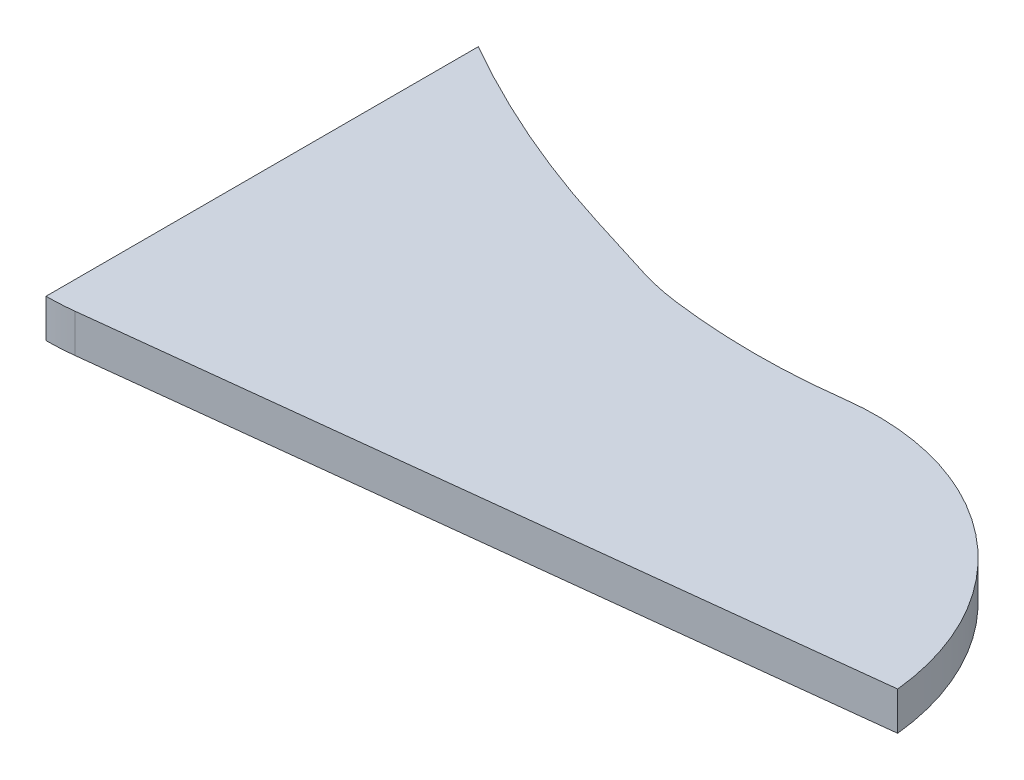
ISO-10303-21;
HEADER;
FILE_DESCRIPTION(('STEP AP214'),'2;1');
FILE_NAME('part.step','',(''),(''),'','','');
FILE_SCHEMA(('AUTOMOTIVE_DESIGN { 1 0 10303 214 1 1 1 1 }'));
ENDSEC;
DATA;
#1=APPLICATION_CONTEXT('core data for automotive mechanical design processes');
#2=APPLICATION_PROTOCOL_DEFINITION('international standard','automotive_design',2000,#1);
#3=PRODUCT_CONTEXT('',#1,'mechanical');
#4=PRODUCT('Part','Part','',(#3));
#5=PRODUCT_RELATED_PRODUCT_CATEGORY('part','',(#4));
#6=PRODUCT_DEFINITION_FORMATION('','',#4);
#7=PRODUCT_DEFINITION_CONTEXT('part definition',#1,'design');
#8=PRODUCT_DEFINITION('design','',#6,#7);
#9=PRODUCT_DEFINITION_SHAPE('','',#8);
#10=(LENGTH_UNIT() NAMED_UNIT(*) SI_UNIT(.MILLI.,.METRE.));
#11=(NAMED_UNIT(*) PLANE_ANGLE_UNIT() SI_UNIT($,.RADIAN.));
#12=(NAMED_UNIT(*) SI_UNIT($,.STERADIAN.) SOLID_ANGLE_UNIT());
#13=UNCERTAINTY_MEASURE_WITH_UNIT(LENGTH_MEASURE(1.E-05),#10,'distance_accuracy_value','');
#14=(GEOMETRIC_REPRESENTATION_CONTEXT(3) GLOBAL_UNCERTAINTY_ASSIGNED_CONTEXT((#13)) GLOBAL_UNIT_ASSIGNED_CONTEXT((#10,
#11,#12)) REPRESENTATION_CONTEXT('',''));
#15=CARTESIAN_POINT('',(0.,0.,0.));
#16=DIRECTION('',(0.,0.,1.));
#17=DIRECTION('',(1.,0.,0.));
#18=AXIS2_PLACEMENT_3D('',#15,#16,#17);
#19=CARTESIAN_POINT('',(1506.36372621651,0.,3.42732559983235));
#20=DIRECTION('',(0.,1.,0.));
#21=DIRECTION('',(0.,0.,1.));
#22=AXIS2_PLACEMENT_3D('',#19,#20,#21);
#23=CYLINDRICAL_SURFACE('',#22,84.1362002294523);
#24=CARTESIAN_POINT('',(1506.36372621651,0.,3.42732559983235));
#25=DIRECTION('',(0.,-1.,0.));
#26=DIRECTION('',(0.,0.,1.));
#27=AXIS2_PLACEMENT_3D('',#24,#25,#26);
#28=CIRCLE('',#27,84.1362002294523);
#29=CARTESIAN_POINT('',(1548.4998584721,0.,-69.3974404319895));
#30=VERTEX_POINT('',#29);
#31=CARTESIAN_POINT('',(1590.05189381204,0.,-5.24393691226619));
#32=VERTEX_POINT('',#31);
#33=EDGE_CURVE('E37',#30,#32,#28,.T.);
#34=ORIENTED_EDGE('',*,*,#33,.F.);
#35=DIRECTION('',(0.,1.,0.));
#36=VECTOR('',#35,1.);
#37=CARTESIAN_POINT('',(1548.4998584721,0.,-69.3974404319895));
#38=LINE('',#37,#36);
#39=CARTESIAN_POINT('',(1548.4998584721,12.7,-69.3974404319895));
#40=VERTEX_POINT('',#39);
#41=EDGE_CURVE('E104',#30,#40,#38,.T.);
#42=ORIENTED_EDGE('',*,*,#41,.T.);
#43=CARTESIAN_POINT('',(1506.36372621651,12.7,3.42732559983235));
#44=DIRECTION('',(0.,-1.,0.));
#45=DIRECTION('',(0.,0.,-1.));
#46=AXIS2_PLACEMENT_3D('',#43,#44,#45);
#47=CIRCLE('',#46,84.1362002294523);
#48=CARTESIAN_POINT('',(1590.05189381204,12.7,-5.24393691226619));
#49=VERTEX_POINT('',#48);
#50=EDGE_CURVE('E91',#49,#40,#47,.F.);
#51=ORIENTED_EDGE('',*,*,#50,.F.);
#52=DIRECTION('',(0.,1.,0.));
#53=VECTOR('',#52,1.);
#54=CARTESIAN_POINT('',(1590.05189381204,0.,-5.24393691226619));
#55=LINE('',#54,#53);
#56=EDGE_CURVE('E102',#32,#49,#55,.T.);
#57=ORIENTED_EDGE('',*,*,#56,.F.);
#58=EDGE_LOOP('',(#34,#42,#51,#57));
#59=FACE_BOUND('',#58,.T.);
#60=ADVANCED_FACE('F33',(#59),#23,.T.);
#61=CARTESIAN_POINT('',(1508.43517084354,0.,-0.152795835996186));
#62=DIRECTION('',(0.,-1.,0.));
#63=DIRECTION('',(0.,0.,-1.));
#64=AXIS2_PLACEMENT_3D('',#61,#62,#63);
#65=CYLINDRICAL_SURFACE('',#64,80.);
#66=CARTESIAN_POINT('',(1508.43517084354,0.,-0.152795835996186));
#67=DIRECTION('',(0.,-1.,0.));
#68=DIRECTION('',(0.,0.,-1.));
#69=AXIS2_PLACEMENT_3D('',#66,#67,#68);
#70=CIRCLE('',#69,80.);
#71=CARTESIAN_POINT('',(1498.18696564296,0.,-79.4936698554248));
#72=VERTEX_POINT('',#71);
#73=EDGE_CURVE('E124',#72,#30,#70,.T.);
#74=ORIENTED_EDGE('',*,*,#73,.F.);
#75=DIRECTION('',(0.,1.,0.));
#76=VECTOR('',#75,1.);
#77=CARTESIAN_POINT('',(1498.18696564296,0.,-79.4936698554248));
#78=LINE('',#77,#76);
#79=CARTESIAN_POINT('',(1498.18696564296,12.7,-79.4936698554248));
#80=VERTEX_POINT('',#79);
#81=EDGE_CURVE('E158',#80,#72,#78,.F.);
#82=ORIENTED_EDGE('',*,*,#81,.F.);
#83=CARTESIAN_POINT('',(1508.43517084354,12.7,-0.152795835996186));
#84=DIRECTION('',(0.,-1.,0.));
#85=DIRECTION('',(0.,0.,-1.));
#86=AXIS2_PLACEMENT_3D('',#83,#84,#85);
#87=CIRCLE('',#86,80.);
#88=EDGE_CURVE('E105',#40,#80,#87,.F.);
#89=ORIENTED_EDGE('',*,*,#88,.F.);
#90=ORIENTED_EDGE('',*,*,#41,.F.);
#91=EDGE_LOOP('',(#74,#82,#89,#90));
#92=FACE_BOUND('',#91,.T.);
#93=ADVANCED_FACE('F202',(#92),#65,.T.);
#94=CARTESIAN_POINT('',(1470.43665954942,0.,-294.334561179895));
#95=DIRECTION('',(0.,1.,0.));
#96=DIRECTION('',(0.,0.,1.));
#97=AXIS2_PLACEMENT_3D('',#94,#95,#96);
#98=CYLINDRICAL_SURFACE('',#97,216.625686550275);
#99=CARTESIAN_POINT('',(1470.43665954942,12.7,-294.334561179895));
#100=DIRECTION('',(0.,-1.,0.));
#101=DIRECTION('',(0.,0.,-1.));
#102=AXIS2_PLACEMENT_3D('',#99,#100,#101);
#103=CIRCLE('',#102,216.625686550275);
#104=CARTESIAN_POINT('',(1442.08235093421,12.7,-79.5725504416563));
#105=VERTEX_POINT('',#104);
#106=EDGE_CURVE('E138',#80,#105,#103,.T.);
#107=ORIENTED_EDGE('',*,*,#106,.F.);
#108=ORIENTED_EDGE('',*,*,#81,.T.);
#109=CARTESIAN_POINT('',(1470.43665954942,0.,-294.334561179895));
#110=DIRECTION('',(0.,1.,0.));
#111=DIRECTION('',(0.,0.,1.));
#112=AXIS2_PLACEMENT_3D('',#109,#110,#111);
#113=CIRCLE('',#112,216.625686550275);
#114=CARTESIAN_POINT('',(1442.08235093421,0.,-79.5725504416563));
#115=VERTEX_POINT('',#114);
#116=EDGE_CURVE('E122',#115,#72,#113,.T.);
#117=ORIENTED_EDGE('',*,*,#116,.F.);
#118=DIRECTION('',(0.,1.,0.));
#119=VECTOR('',#118,1.);
#120=CARTESIAN_POINT('',(1442.08235093421,0.,-79.5725504416563));
#121=LINE('',#120,#119);
#122=EDGE_CURVE('E155',#115,#105,#121,.T.);
#123=ORIENTED_EDGE('',*,*,#122,.T.);
#124=EDGE_LOOP('',(#107,#108,#117,#123));
#125=FACE_BOUND('',#124,.T.);
#126=ADVANCED_FACE('F198',(#125),#98,.F.);
#127=CARTESIAN_POINT('',(1452.55361463954,0.,-158.884293811811));
#128=DIRECTION('',(0.,1.,0.));
#129=DIRECTION('',(0.,0.,1.));
#130=AXIS2_PLACEMENT_3D('',#127,#128,#129);
#131=CYLINDRICAL_SURFACE('',#130,80.);
#132=CARTESIAN_POINT('',(1452.55361463954,0.,-158.884293811811));
#133=DIRECTION('',(0.,-1.,0.));
#134=DIRECTION('',(0.,0.,-1.));
#135=AXIS2_PLACEMENT_3D('',#132,#133,#134);
#136=CIRCLE('',#135,80.);
#137=CARTESIAN_POINT('',(1428.70474885798,0.,-82.5217925370811));
#138=VERTEX_POINT('',#137);
#139=EDGE_CURVE('E125',#138,#115,#136,.F.);
#140=ORIENTED_EDGE('',*,*,#139,.F.);
#141=DIRECTION('',(0.,-1.,0.));
#142=VECTOR('',#141,1.);
#143=CARTESIAN_POINT('',(1428.70474885798,0.,-82.5217925370811));
#144=LINE('',#143,#142);
#145=CARTESIAN_POINT('',(1428.70474885798,12.7,-82.5217925370811));
#146=VERTEX_POINT('',#145);
#147=EDGE_CURVE('E11',#146,#138,#144,.T.);
#148=ORIENTED_EDGE('',*,*,#147,.F.);
#149=CARTESIAN_POINT('',(1452.55361463954,12.7,-158.884293811811));
#150=DIRECTION('',(0.,-1.,0.));
#151=DIRECTION('',(0.,0.,-1.));
#152=AXIS2_PLACEMENT_3D('',#149,#150,#151);
#153=CIRCLE('',#152,80.);
#154=EDGE_CURVE('E134',#105,#146,#153,.T.);
#155=ORIENTED_EDGE('',*,*,#154,.F.);
#156=ORIENTED_EDGE('',*,*,#122,.F.);
#157=EDGE_LOOP('',(#140,#148,#155,#156));
#158=FACE_BOUND('',#157,.T.);
#159=ADVANCED_FACE('F192',(#158),#131,.F.);
#160=CARTESIAN_POINT('',(1434.50959288233,0.,-80.7088746296199));
#161=DIRECTION('',(-0.298110822269484,0.,0.95453126593413));
#162=DIRECTION('',(0.95453126593413,0.,0.298110822269484));
#163=AXIS2_PLACEMENT_3D('',#160,#161,#162);
#164=PLANE('',#163);
#165=DIRECTION('',(0.95453126593413,0.,0.298110822269484));
#166=VECTOR('',#165,1.);
#167=CARTESIAN_POINT('',(1434.50959288233,12.7,-80.7088746296199));
#168=LINE('',#167,#166);
#169=CARTESIAN_POINT('',(1406.2754231399,12.7,-89.526722570697));
#170=VERTEX_POINT('',#169);
#171=EDGE_CURVE('E43',#170,#146,#168,.T.);
#172=ORIENTED_EDGE('',*,*,#171,.T.);
#173=ORIENTED_EDGE('',*,*,#147,.T.);
#174=DIRECTION('',(0.95453126593413,0.,0.298110822269484));
#175=VECTOR('',#174,1.);
#176=CARTESIAN_POINT('',(1434.50959288233,0.,-80.7088746296199));
#177=LINE('',#176,#175);
#178=CARTESIAN_POINT('',(1406.2754231399,0.,-89.5267225706972));
#179=VERTEX_POINT('',#178);
#180=EDGE_CURVE('E126',#179,#138,#177,.T.);
#181=ORIENTED_EDGE('',*,*,#180,.F.);
#182=DIRECTION('',(0.,-1.,0.));
#183=VECTOR('',#182,1.);
#184=CARTESIAN_POINT('',(1406.2754231399,12.7,-89.5267225706972));
#185=LINE('',#184,#183);
#186=EDGE_CURVE('E115',#170,#179,#185,.T.);
#187=ORIENTED_EDGE('',*,*,#186,.F.);
#188=EDGE_LOOP('',(#172,#173,#181,#187));
#189=FACE_BOUND('',#188,.T.);
#190=ADVANCED_FACE('F190',(#189),#164,.F.);
#191=CARTESIAN_POINT('',(1341.11532169882,12.7,23.1188028599802));
#192=DIRECTION('',(-0.113203213767907,0.,-0.993571855676587));
#193=DIRECTION('',(-0.993571855676587,0.,0.113203213767907));
#194=AXIS2_PLACEMENT_3D('',#191,#192,#193);
#195=PLANE('',#194);
#196=DIRECTION('',(0.993571855676587,0.,-0.113203213767907));
#197=VECTOR('',#196,1.);
#198=CARTESIAN_POINT('',(1341.11532169882,12.7,23.1188028599802));
#199=LINE('',#198,#197);
#200=CARTESIAN_POINT('',(1345.62884959004,12.7,22.6045513141072));
#201=VERTEX_POINT('',#200);
#202=EDGE_CURVE('E88',#201,#49,#199,.T.);
#203=ORIENTED_EDGE('',*,*,#202,.F.);
#204=DIRECTION('',(0.,-1.,0.));
#205=VECTOR('',#204,1.);
#206=CARTESIAN_POINT('',(1345.62884959004,12.7,22.6045513141072));
#207=LINE('',#206,#205);
#208=CARTESIAN_POINT('',(1345.62884959004,0.,22.6045513141072));
#209=VERTEX_POINT('',#208);
#210=EDGE_CURVE('E117',#201,#209,#207,.T.);
#211=ORIENTED_EDGE('',*,*,#210,.T.);
#212=DIRECTION('',(0.993571855676587,0.,-0.113203213767907));
#213=VECTOR('',#212,1.);
#214=CARTESIAN_POINT('',(1341.11532169882,0.,23.1188028599802));
#215=LINE('',#214,#213);
#216=EDGE_CURVE('E110',#209,#32,#215,.T.);
#217=ORIENTED_EDGE('',*,*,#216,.T.);
#218=ORIENTED_EDGE('',*,*,#56,.T.);
#219=EDGE_LOOP('',(#203,#211,#217,#218));
#220=FACE_BOUND('',#219,.T.);
#221=ADVANCED_FACE('F108',(#220),#195,.F.);
#222=CARTESIAN_POINT('',(1336.57259248861,12.7,-56.8811971400198));
#223=DIRECTION('',(0.,-1.,0.));
#224=DIRECTION('',(0.,0.,-1.));
#225=AXIS2_PLACEMENT_3D('',#222,#223,#224);
#226=CYLINDRICAL_SURFACE('',#225,80.);
#227=CARTESIAN_POINT('',(1336.57259248861,12.7,-56.8811971400198));
#228=DIRECTION('',(0.,-1.,0.));
#229=DIRECTION('',(0.,0.,-1.));
#230=AXIS2_PLACEMENT_3D('',#227,#228,#229);
#231=CIRCLE('',#230,80.);
#232=CARTESIAN_POINT('',(1336.57259248861,12.7,23.1188028599801));
#233=VERTEX_POINT('',#232);
#234=EDGE_CURVE('E94',#233,#201,#231,.F.);
#235=ORIENTED_EDGE('',*,*,#234,.F.);
#236=DIRECTION('',(0.,-1.,0.));
#237=VECTOR('',#236,1.);
#238=CARTESIAN_POINT('',(1336.57259248861,0.,23.1188028599802));
#239=LINE('',#238,#237);
#240=CARTESIAN_POINT('',(1336.57259248861,0.,23.1188028599802));
#241=VERTEX_POINT('',#240);
#242=EDGE_CURVE('E143',#241,#233,#239,.F.);
#243=ORIENTED_EDGE('',*,*,#242,.F.);
#244=CARTESIAN_POINT('',(1336.57259248861,0.,-56.8811971400198));
#245=DIRECTION('',(0.,-1.,0.));
#246=DIRECTION('',(0.,0.,-1.));
#247=AXIS2_PLACEMENT_3D('',#244,#245,#246);
#248=CIRCLE('',#247,80.);
#249=EDGE_CURVE('E52',#209,#241,#248,.T.);
#250=ORIENTED_EDGE('',*,*,#249,.F.);
#251=ORIENTED_EDGE('',*,*,#210,.F.);
#252=EDGE_LOOP('',(#235,#243,#250,#251));
#253=FACE_BOUND('',#252,.T.);
#254=ADVANCED_FACE('F182',(#253),#226,.T.);
#255=CARTESIAN_POINT('',(1510.84903128506,12.7,-424.364544982479));
#256=DIRECTION('',(0.,-1.,0.));
#257=DIRECTION('',(0.,0.,-1.));
#258=AXIS2_PLACEMENT_3D('',#255,#256,#257);
#259=CYLINDRICAL_SURFACE('',#258,350.787694821186);
#260=CARTESIAN_POINT('',(1510.84903128506,0.,-424.364544982479));
#261=DIRECTION('',(0.,-1.,0.));
#262=DIRECTION('',(0.,0.,1.));
#263=AXIS2_PLACEMENT_3D('',#260,#261,#262);
#264=CIRCLE('',#263,350.787694821186);
#265=CARTESIAN_POINT('',(1336.57259248861,0.,-119.93108801957));
#266=VERTEX_POINT('',#265);
#267=EDGE_CURVE('E112',#179,#266,#264,.T.);
#268=ORIENTED_EDGE('',*,*,#267,.T.);
#269=DIRECTION('',(0.,-1.,0.));
#270=VECTOR('',#269,1.);
#271=CARTESIAN_POINT('',(1336.57259248861,12.7,-119.93108801957));
#272=LINE('',#271,#270);
#273=CARTESIAN_POINT('',(1336.57259248861,12.7,-119.93108801957));
#274=VERTEX_POINT('',#273);
#275=EDGE_CURVE('E168',#266,#274,#272,.F.);
#276=ORIENTED_EDGE('',*,*,#275,.T.);
#277=CARTESIAN_POINT('',(1510.84903128506,12.7,-424.364544982479));
#278=DIRECTION('',(0.,-1.,0.));
#279=DIRECTION('',(0.,0.,1.));
#280=AXIS2_PLACEMENT_3D('',#277,#278,#279);
#281=CIRCLE('',#280,350.787694821186);
#282=EDGE_CURVE('E128',#170,#274,#281,.T.);
#283=ORIENTED_EDGE('',*,*,#282,.F.);
#284=ORIENTED_EDGE('',*,*,#186,.T.);
#285=EDGE_LOOP('',(#268,#276,#283,#284));
#286=FACE_BOUND('',#285,.T.);
#287=ADVANCED_FACE('F172',(#286),#259,.F.);
#288=CARTESIAN_POINT('',(104.459315348819,0.,54.8130718176911));
#289=DIRECTION('',(0.,-1.,0.));
#290=DIRECTION('',(0.,0.,-1.));
#291=AXIS2_PLACEMENT_3D('',#288,#289,#290);
#292=PLANE('',#291);
#293=DIRECTION('',(0.,0.,1.));
#294=VECTOR('',#293,1.);
#295=CARTESIAN_POINT('',(1336.57259248861,0.,54.8130718176911));
#296=LINE('',#295,#294);
#297=EDGE_CURVE('E165',#266,#241,#296,.T.);
#298=ORIENTED_EDGE('',*,*,#297,.F.);
#299=ORIENTED_EDGE('',*,*,#267,.F.);
#300=ORIENTED_EDGE('',*,*,#180,.T.);
#301=ORIENTED_EDGE('',*,*,#139,.T.);
#302=ORIENTED_EDGE('',*,*,#116,.T.);
#303=ORIENTED_EDGE('',*,*,#73,.T.);
#304=ORIENTED_EDGE('',*,*,#33,.T.);
#305=ORIENTED_EDGE('',*,*,#216,.F.);
#306=ORIENTED_EDGE('',*,*,#249,.T.);
#307=EDGE_LOOP('',(#298,#299,#300,#301,#302,#303,#304,#305,#306));
#308=FACE_BOUND('',#307,.T.);
#309=ADVANCED_FACE('F181',(#308),#292,.T.);
#310=CARTESIAN_POINT('',(104.459315348819,12.7,54.8130718176911));
#311=DIRECTION('',(0.,-1.,0.));
#312=DIRECTION('',(0.,0.,-1.));
#313=AXIS2_PLACEMENT_3D('',#310,#311,#312);
#314=PLANE('',#313);
#315=ORIENTED_EDGE('',*,*,#282,.T.);
#316=DIRECTION('',(0.,0.,1.));
#317=VECTOR('',#316,1.);
#318=CARTESIAN_POINT('',(1336.57259248861,12.7,54.8130718176911));
#319=LINE('',#318,#317);
#320=EDGE_CURVE('E150',#274,#233,#319,.T.);
#321=ORIENTED_EDGE('',*,*,#320,.T.);
#322=ORIENTED_EDGE('',*,*,#234,.T.);
#323=ORIENTED_EDGE('',*,*,#202,.T.);
#324=ORIENTED_EDGE('',*,*,#50,.T.);
#325=ORIENTED_EDGE('',*,*,#88,.T.);
#326=ORIENTED_EDGE('',*,*,#106,.T.);
#327=ORIENTED_EDGE('',*,*,#154,.T.);
#328=ORIENTED_EDGE('',*,*,#171,.F.);
#329=EDGE_LOOP('',(#315,#321,#322,#323,#324,#325,#326,#327,#328));
#330=FACE_BOUND('',#329,.T.);
#331=ADVANCED_FACE('F35',(#330),#314,.F.);
#332=CARTESIAN_POINT('',(1336.57259248861,-2.50000000007189E-05,23.1188028599801));
#333=DIRECTION('',(1.,0.,0.));
#334=DIRECTION('',(0.,0.,-1.));
#335=AXIS2_PLACEMENT_3D('',#332,#333,#334);
#336=PLANE('',#335);
#337=ORIENTED_EDGE('',*,*,#275,.F.);
#338=ORIENTED_EDGE('',*,*,#297,.T.);
#339=ORIENTED_EDGE('',*,*,#242,.T.);
#340=ORIENTED_EDGE('',*,*,#320,.F.);
#341=EDGE_LOOP('',(#337,#338,#339,#340));
#342=FACE_BOUND('',#341,.T.);
#343=ADVANCED_FACE('F178',(#342),#336,.F.);
#344=CLOSED_SHELL('',(#60,#93,#126,#159,#190,#221,#254,#287,#309,#331,#343));
#345=MANIFOLD_SOLID_BREP('B2',#344);
#346=ADVANCED_BREP_SHAPE_REPRESENTATION('',(#18,#345),#14);
#347=SHAPE_DEFINITION_REPRESENTATION(#9,#346);
ENDSEC;
END-ISO-10303-21;
